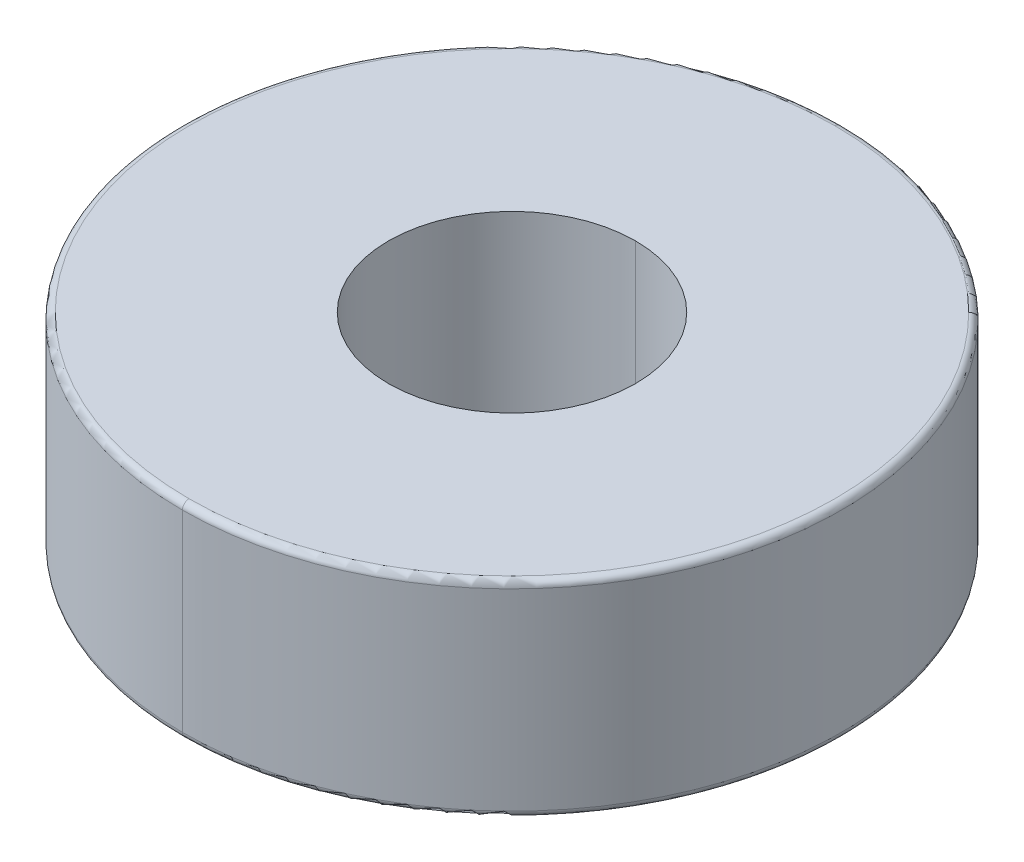
ISO-10303-21;
HEADER;
FILE_DESCRIPTION(('STEP AP214'),'2;1');
FILE_NAME('part.step','',(''),(''),'','','');
FILE_SCHEMA(('AUTOMOTIVE_DESIGN { 1 0 10303 214 1 1 1 1 }'));
ENDSEC;
DATA;
#1=APPLICATION_CONTEXT('core data for automotive mechanical design processes');
#2=APPLICATION_PROTOCOL_DEFINITION('international standard','automotive_design',2000,#1);
#3=PRODUCT_CONTEXT('',#1,'mechanical');
#4=PRODUCT('Part','Part','',(#3));
#5=PRODUCT_RELATED_PRODUCT_CATEGORY('part','',(#4));
#6=PRODUCT_DEFINITION_FORMATION('','',#4);
#7=PRODUCT_DEFINITION_CONTEXT('part definition',#1,'design');
#8=PRODUCT_DEFINITION('design','',#6,#7);
#9=PRODUCT_DEFINITION_SHAPE('','',#8);
#10=(LENGTH_UNIT() NAMED_UNIT(*) SI_UNIT(.MILLI.,.METRE.));
#11=(NAMED_UNIT(*) PLANE_ANGLE_UNIT() SI_UNIT($,.RADIAN.));
#12=(NAMED_UNIT(*) SI_UNIT($,.STERADIAN.) SOLID_ANGLE_UNIT());
#13=UNCERTAINTY_MEASURE_WITH_UNIT(LENGTH_MEASURE(1.E-05),#10,'distance_accuracy_value','');
#14=(GEOMETRIC_REPRESENTATION_CONTEXT(3) GLOBAL_UNCERTAINTY_ASSIGNED_CONTEXT((#13)) GLOBAL_UNIT_ASSIGNED_CONTEXT((#10,
#11,#12)) REPRESENTATION_CONTEXT('',''));
#15=CARTESIAN_POINT('',(0.,0.,0.));
#16=DIRECTION('',(0.,0.,1.));
#17=DIRECTION('',(1.,0.,0.));
#18=AXIS2_PLACEMENT_3D('',#15,#16,#17);
#19=CARTESIAN_POINT('',(0.,14.216230180668,0.));
#20=DIRECTION('',(0.,1.,0.));
#21=DIRECTION('',(0.,0.,1.));
#22=AXIS2_PLACEMENT_3D('',#19,#20,#21);
#23=TOROIDAL_SURFACE('',#22,12.446,0.254);
#24=CARTESIAN_POINT('',(0.,14.216230180668,0.));
#25=DIRECTION('',(0.,-1.,0.));
#26=DIRECTION('',(0.,0.,1.));
#27=AXIS2_PLACEMENT_3D('',#24,#25,#26);
#28=CIRCLE('',#27,12.7);
#29=CARTESIAN_POINT('',(0.,14.216230180668,-12.7));
#30=VERTEX_POINT('',#29);
#31=CARTESIAN_POINT('',(0.,14.216230180668,12.7));
#32=VERTEX_POINT('',#31);
#33=EDGE_CURVE('E154',#30,#32,#28,.T.);
#34=ORIENTED_EDGE('',*,*,#33,.F.);
#35=CARTESIAN_POINT('',(0.,14.216230180668,-12.446));
#36=DIRECTION('',(1.,0.,0.));
#37=DIRECTION('',(0.,0.,-1.));
#38=AXIS2_PLACEMENT_3D('',#35,#36,#37);
#39=CIRCLE('',#38,0.254);
#40=CARTESIAN_POINT('',(0.,14.470230180668,-12.446));
#41=VERTEX_POINT('',#40);
#42=EDGE_CURVE('E10',#30,#41,#39,.T.);
#43=ORIENTED_EDGE('',*,*,#42,.T.);
#44=CARTESIAN_POINT('',(0.,14.470230180668,0.));
#45=DIRECTION('',(0.,1.,0.));
#46=DIRECTION('',(0.,0.,1.));
#47=AXIS2_PLACEMENT_3D('',#44,#45,#46);
#48=CIRCLE('',#47,12.446);
#49=CARTESIAN_POINT('',(0.,14.470230180668,12.446));
#50=VERTEX_POINT('',#49);
#51=EDGE_CURVE('E165',#50,#41,#48,.T.);
#52=ORIENTED_EDGE('',*,*,#51,.F.);
#53=CARTESIAN_POINT('',(0.,14.216230180668,12.446));
#54=DIRECTION('',(-1.,0.,0.));
#55=DIRECTION('',(0.,0.,1.));
#56=AXIS2_PLACEMENT_3D('',#53,#54,#55);
#57=CIRCLE('',#56,0.254);
#58=EDGE_CURVE('E122',#32,#50,#57,.T.);
#59=ORIENTED_EDGE('',*,*,#58,.F.);
#60=EDGE_LOOP('',(#34,#43,#52,#59));
#61=FACE_BOUND('',#60,.T.);
#62=ADVANCED_FACE('F16',(#61),#23,.T.);
#63=CARTESIAN_POINT('',(0.,6.79943018066803,0.));
#64=DIRECTION('',(0.,-1.,0.));
#65=DIRECTION('',(0.,0.,-1.));
#66=AXIS2_PLACEMENT_3D('',#63,#64,#65);
#67=TOROIDAL_SURFACE('',#66,12.446,0.254);
#68=CARTESIAN_POINT('',(0.,6.79943018066803,0.));
#69=DIRECTION('',(0.,1.,0.));
#70=DIRECTION('',(0.,0.,-1.));
#71=AXIS2_PLACEMENT_3D('',#68,#69,#70);
#72=CIRCLE('',#71,12.7);
#73=CARTESIAN_POINT('',(0.,6.79943018066803,12.7));
#74=VERTEX_POINT('',#73);
#75=CARTESIAN_POINT('',(0.,6.79943018066803,-12.7));
#76=VERTEX_POINT('',#75);
#77=EDGE_CURVE('E58',#74,#76,#72,.T.);
#78=ORIENTED_EDGE('',*,*,#77,.F.);
#79=CARTESIAN_POINT('',(0.,6.79943018066803,12.446));
#80=DIRECTION('',(1.,0.,0.));
#81=DIRECTION('',(0.,0.,-1.));
#82=AXIS2_PLACEMENT_3D('',#79,#80,#81);
#83=CIRCLE('',#82,0.254);
#84=CARTESIAN_POINT('',(0.,6.54543018066803,12.446));
#85=VERTEX_POINT('',#84);
#86=EDGE_CURVE('E27',#74,#85,#83,.T.);
#87=ORIENTED_EDGE('',*,*,#86,.T.);
#88=CARTESIAN_POINT('',(0.,6.54543018066803,0.));
#89=DIRECTION('',(0.,-1.,0.));
#90=DIRECTION('',(0.,0.,-1.));
#91=AXIS2_PLACEMENT_3D('',#88,#89,#90);
#92=CIRCLE('',#91,12.446);
#93=CARTESIAN_POINT('',(0.,6.54543018066803,-12.446));
#94=VERTEX_POINT('',#93);
#95=EDGE_CURVE('E73',#94,#85,#92,.T.);
#96=ORIENTED_EDGE('',*,*,#95,.F.);
#97=CARTESIAN_POINT('',(0.,6.79943018066803,-12.446));
#98=DIRECTION('',(-1.,0.,0.));
#99=DIRECTION('',(0.,0.,1.));
#100=AXIS2_PLACEMENT_3D('',#97,#98,#99);
#101=CIRCLE('',#100,0.254);
#102=EDGE_CURVE('E116',#76,#94,#101,.T.);
#103=ORIENTED_EDGE('',*,*,#102,.F.);
#104=EDGE_LOOP('',(#78,#87,#96,#103));
#105=FACE_BOUND('',#104,.T.);
#106=ADVANCED_FACE('F117',(#105),#67,.T.);
#107=CARTESIAN_POINT('',(0.,0.,0.));
#108=DIRECTION('',(0.,-1.,0.));
#109=DIRECTION('',(0.,0.,-1.));
#110=AXIS2_PLACEMENT_3D('',#107,#108,#109);
#111=CYLINDRICAL_SURFACE('',#110,4.7625);
#112=CARTESIAN_POINT('',(0.,14.470230180668,0.));
#113=DIRECTION('',(0.,-1.,0.));
#114=DIRECTION('',(0.,0.,-1.));
#115=AXIS2_PLACEMENT_3D('',#112,#113,#114);
#116=CIRCLE('',#115,4.7625);
#117=CARTESIAN_POINT('',(0.,14.470230180668,4.7625));
#118=VERTEX_POINT('',#117);
#119=CARTESIAN_POINT('',(0.,14.470230180668,-4.7625));
#120=VERTEX_POINT('',#119);
#121=EDGE_CURVE('E89',#118,#120,#116,.T.);
#122=ORIENTED_EDGE('',*,*,#121,.F.);
#123=DIRECTION('',(0.,-1.,0.));
#124=VECTOR('',#123,1.);
#125=CARTESIAN_POINT('',(0.,0.,4.7625));
#126=LINE('',#125,#124);
#127=CARTESIAN_POINT('',(0.,6.54543018066803,4.7625));
#128=VERTEX_POINT('',#127);
#129=EDGE_CURVE('E157',#118,#128,#126,.T.);
#130=ORIENTED_EDGE('',*,*,#129,.T.);
#131=CARTESIAN_POINT('',(0.,6.54543018066803,0.));
#132=DIRECTION('',(0.,-1.,0.));
#133=DIRECTION('',(0.,0.,-1.));
#134=AXIS2_PLACEMENT_3D('',#131,#132,#133);
#135=CIRCLE('',#134,4.7625);
#136=CARTESIAN_POINT('',(0.,6.54543018066803,-4.7625));
#137=VERTEX_POINT('',#136);
#138=EDGE_CURVE('E109',#128,#137,#135,.T.);
#139=ORIENTED_EDGE('',*,*,#138,.T.);
#140=DIRECTION('',(0.,-1.,0.));
#141=VECTOR('',#140,1.);
#142=CARTESIAN_POINT('',(0.,0.,-4.7625));
#143=LINE('',#142,#141);
#144=EDGE_CURVE('E99',#120,#137,#143,.T.);
#145=ORIENTED_EDGE('',*,*,#144,.F.);
#146=EDGE_LOOP('',(#122,#130,#139,#145));
#147=FACE_BOUND('',#146,.T.);
#148=ADVANCED_FACE('F295',(#147),#111,.F.);
#149=CARTESIAN_POINT('',(0.,0.,0.));
#150=DIRECTION('',(0.,-1.,0.));
#151=DIRECTION('',(0.,0.,-1.));
#152=AXIS2_PLACEMENT_3D('',#149,#150,#151);
#153=CYLINDRICAL_SURFACE('',#152,12.7);
#154=ORIENTED_EDGE('',*,*,#33,.T.);
#155=DIRECTION('',(0.,-1.,0.));
#156=VECTOR('',#155,1.);
#157=CARTESIAN_POINT('',(0.,0.,12.7));
#158=LINE('',#157,#156);
#159=EDGE_CURVE('E135',#32,#74,#158,.T.);
#160=ORIENTED_EDGE('',*,*,#159,.T.);
#161=ORIENTED_EDGE('',*,*,#77,.T.);
#162=DIRECTION('',(0.,-1.,0.));
#163=VECTOR('',#162,1.);
#164=CARTESIAN_POINT('',(0.,0.,-12.7));
#165=LINE('',#164,#163);
#166=EDGE_CURVE('E42',#30,#76,#165,.T.);
#167=ORIENTED_EDGE('',*,*,#166,.F.);
#168=EDGE_LOOP('',(#154,#160,#161,#167));
#169=FACE_BOUND('',#168,.T.);
#170=ADVANCED_FACE('F134',(#169),#153,.T.);
#171=CARTESIAN_POINT('',(0.,0.,0.));
#172=DIRECTION('',(0.,-1.,0.));
#173=DIRECTION('',(0.,0.,-1.));
#174=AXIS2_PLACEMENT_3D('',#171,#172,#173);
#175=CYLINDRICAL_SURFACE('',#174,12.7);
#176=ORIENTED_EDGE('',*,*,#159,.F.);
#177=CARTESIAN_POINT('',(0.,14.216230180668,0.));
#178=DIRECTION('',(0.,-1.,0.));
#179=DIRECTION('',(0.,0.,1.));
#180=AXIS2_PLACEMENT_3D('',#177,#178,#179);
#181=CIRCLE('',#180,12.7);
#182=EDGE_CURVE('E131',#32,#30,#181,.T.);
#183=ORIENTED_EDGE('',*,*,#182,.T.);
#184=ORIENTED_EDGE('',*,*,#166,.T.);
#185=CARTESIAN_POINT('',(0.,6.79943018066803,0.));
#186=DIRECTION('',(0.,1.,0.));
#187=DIRECTION('',(0.,0.,-1.));
#188=AXIS2_PLACEMENT_3D('',#185,#186,#187);
#189=CIRCLE('',#188,12.7);
#190=EDGE_CURVE('E129',#76,#74,#189,.T.);
#191=ORIENTED_EDGE('',*,*,#190,.T.);
#192=EDGE_LOOP('',(#176,#183,#184,#191));
#193=FACE_BOUND('',#192,.T.);
#194=ADVANCED_FACE('F128',(#193),#175,.T.);
#195=CARTESIAN_POINT('',(4.7625,6.54543018066803,0.));
#196=DIRECTION('',(0.,-1.,0.));
#197=DIRECTION('',(0.,0.,-1.));
#198=AXIS2_PLACEMENT_3D('',#195,#196,#197);
#199=PLANE('',#198);
#200=ORIENTED_EDGE('',*,*,#95,.T.);
#201=CARTESIAN_POINT('',(0.,6.54543018066803,0.));
#202=DIRECTION('',(0.,-1.,0.));
#203=DIRECTION('',(0.,0.,-1.));
#204=AXIS2_PLACEMENT_3D('',#201,#202,#203);
#205=CIRCLE('',#204,12.446);
#206=EDGE_CURVE('E146',#85,#94,#205,.T.);
#207=ORIENTED_EDGE('',*,*,#206,.T.);
#208=EDGE_LOOP('',(#200,#207));
#209=FACE_BOUND('',#208,.T.);
#210=CARTESIAN_POINT('',(0.,6.54543018066803,0.));
#211=DIRECTION('',(0.,-1.,0.));
#212=DIRECTION('',(0.,0.,-1.));
#213=AXIS2_PLACEMENT_3D('',#210,#211,#212);
#214=CIRCLE('',#213,4.7625);
#215=EDGE_CURVE('E20',#137,#128,#214,.T.);
#216=ORIENTED_EDGE('',*,*,#215,.F.);
#217=ORIENTED_EDGE('',*,*,#138,.F.);
#218=EDGE_LOOP('',(#216,#217));
#219=FACE_BOUND('',#218,.T.);
#220=ADVANCED_FACE('F18',(#209,#219),#199,.T.);
#221=CARTESIAN_POINT('',(0.,0.,0.));
#222=DIRECTION('',(0.,-1.,0.));
#223=DIRECTION('',(0.,0.,-1.));
#224=AXIS2_PLACEMENT_3D('',#221,#222,#223);
#225=CYLINDRICAL_SURFACE('',#224,4.7625);
#226=ORIENTED_EDGE('',*,*,#129,.F.);
#227=CARTESIAN_POINT('',(0.,14.470230180668,0.));
#228=DIRECTION('',(0.,-1.,0.));
#229=DIRECTION('',(0.,0.,-1.));
#230=AXIS2_PLACEMENT_3D('',#227,#228,#229);
#231=CIRCLE('',#230,4.7625);
#232=EDGE_CURVE('E151',#120,#118,#231,.T.);
#233=ORIENTED_EDGE('',*,*,#232,.F.);
#234=ORIENTED_EDGE('',*,*,#144,.T.);
#235=ORIENTED_EDGE('',*,*,#215,.T.);
#236=EDGE_LOOP('',(#226,#233,#234,#235));
#237=FACE_BOUND('',#236,.T.);
#238=ADVANCED_FACE('F182',(#237),#225,.F.);
#239=CARTESIAN_POINT('',(4.7625,14.470230180668,0.));
#240=DIRECTION('',(0.,1.,0.));
#241=DIRECTION('',(1.,0.,0.));
#242=AXIS2_PLACEMENT_3D('',#239,#240,#241);
#243=PLANE('',#242);
#244=ORIENTED_EDGE('',*,*,#51,.T.);
#245=CARTESIAN_POINT('',(0.,14.470230180668,0.));
#246=DIRECTION('',(0.,1.,0.));
#247=DIRECTION('',(0.,0.,1.));
#248=AXIS2_PLACEMENT_3D('',#245,#246,#247);
#249=CIRCLE('',#248,12.446);
#250=EDGE_CURVE('E162',#41,#50,#249,.T.);
#251=ORIENTED_EDGE('',*,*,#250,.T.);
#252=EDGE_LOOP('',(#244,#251));
#253=FACE_BOUND('',#252,.T.);
#254=ORIENTED_EDGE('',*,*,#232,.T.);
#255=ORIENTED_EDGE('',*,*,#121,.T.);
#256=EDGE_LOOP('',(#254,#255));
#257=FACE_BOUND('',#256,.T.);
#258=ADVANCED_FACE('F318',(#253,#257),#243,.T.);
#259=CARTESIAN_POINT('',(0.,6.79943018066803,0.));
#260=DIRECTION('',(0.,-1.,0.));
#261=DIRECTION('',(0.,0.,-1.));
#262=AXIS2_PLACEMENT_3D('',#259,#260,#261);
#263=TOROIDAL_SURFACE('',#262,12.446,0.254);
#264=ORIENTED_EDGE('',*,*,#86,.F.);
#265=ORIENTED_EDGE('',*,*,#190,.F.);
#266=ORIENTED_EDGE('',*,*,#102,.T.);
#267=ORIENTED_EDGE('',*,*,#206,.F.);
#268=EDGE_LOOP('',(#264,#265,#266,#267));
#269=FACE_BOUND('',#268,.T.);
#270=ADVANCED_FACE('F139',(#269),#263,.T.);
#271=CARTESIAN_POINT('',(0.,14.216230180668,0.));
#272=DIRECTION('',(0.,1.,0.));
#273=DIRECTION('',(0.,0.,1.));
#274=AXIS2_PLACEMENT_3D('',#271,#272,#273);
#275=TOROIDAL_SURFACE('',#274,12.446,0.254);
#276=ORIENTED_EDGE('',*,*,#42,.F.);
#277=ORIENTED_EDGE('',*,*,#182,.F.);
#278=ORIENTED_EDGE('',*,*,#58,.T.);
#279=ORIENTED_EDGE('',*,*,#250,.F.);
#280=EDGE_LOOP('',(#276,#277,#278,#279));
#281=FACE_BOUND('',#280,.T.);
#282=ADVANCED_FACE('F338',(#281),#275,.T.);
#283=CLOSED_SHELL('',(#62,#106,#148,#170,#194,#220,#238,#258,#270,#282));
#284=MANIFOLD_SOLID_BREP('B1',#283);
#285=ADVANCED_BREP_SHAPE_REPRESENTATION('',(#18,#284),#14);
#286=SHAPE_DEFINITION_REPRESENTATION(#9,#285);
ENDSEC;
END-ISO-10303-21;
